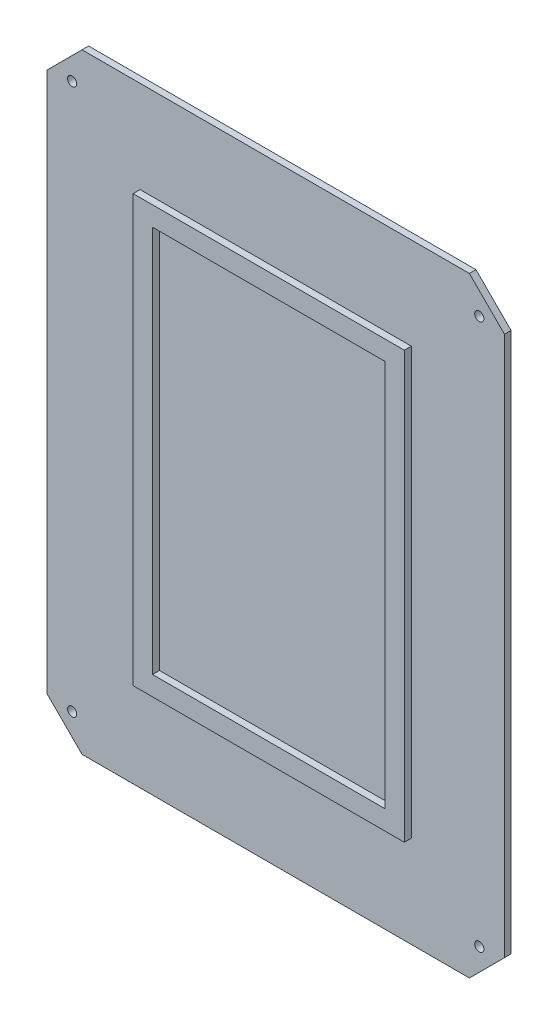
ISO-10303-21;
HEADER;
FILE_DESCRIPTION(('STEP AP214'),'2;1');
FILE_NAME('part.step','',(''),(''),'','','');
FILE_SCHEMA(('AUTOMOTIVE_DESIGN { 1 0 10303 214 1 1 1 1 }'));
ENDSEC;
DATA;
#1=APPLICATION_CONTEXT('core data for automotive mechanical design processes');
#2=APPLICATION_PROTOCOL_DEFINITION('international standard','automotive_design',2000,#1);
#3=PRODUCT_CONTEXT('',#1,'mechanical');
#4=PRODUCT('Part','Part','',(#3));
#5=PRODUCT_RELATED_PRODUCT_CATEGORY('part','',(#4));
#6=PRODUCT_DEFINITION_FORMATION('','',#4);
#7=PRODUCT_DEFINITION_CONTEXT('part definition',#1,'design');
#8=PRODUCT_DEFINITION('design','',#6,#7);
#9=PRODUCT_DEFINITION_SHAPE('','',#8);
#10=(LENGTH_UNIT() NAMED_UNIT(*) SI_UNIT(.MILLI.,.METRE.));
#11=(NAMED_UNIT(*) PLANE_ANGLE_UNIT() SI_UNIT($,.RADIAN.));
#12=(NAMED_UNIT(*) SI_UNIT($,.STERADIAN.) SOLID_ANGLE_UNIT());
#13=UNCERTAINTY_MEASURE_WITH_UNIT(LENGTH_MEASURE(1.E-05),#10,'distance_accuracy_value','');
#14=(GEOMETRIC_REPRESENTATION_CONTEXT(3) GLOBAL_UNCERTAINTY_ASSIGNED_CONTEXT((#13)) GLOBAL_UNIT_ASSIGNED_CONTEXT((#10,
#11,#12)) REPRESENTATION_CONTEXT('',''));
#15=CARTESIAN_POINT('',(0.,0.,0.));
#16=DIRECTION('',(0.,0.,1.));
#17=DIRECTION('',(1.,0.,0.));
#18=AXIS2_PLACEMENT_3D('',#15,#16,#17);
#19=CARTESIAN_POINT('',(-149.987,-177.025,-2.159));
#20=DIRECTION('',(-1.,0.,0.));
#21=DIRECTION('',(0.,0.,1.));
#22=AXIS2_PLACEMENT_3D('',#19,#20,#21);
#23=PLANE('',#22);
#24=DIRECTION('',(0.,0.,1.));
#25=VECTOR('',#24,1.);
#26=CARTESIAN_POINT('',(-149.987,-177.025,-2.159));
#27=LINE('',#26,#25);
#28=CARTESIAN_POINT('',(-149.987,-177.025,-2.159));
#29=VERTEX_POINT('',#28);
#30=CARTESIAN_POINT('',(-149.987,-177.025,2.159));
#31=VERTEX_POINT('',#30);
#32=EDGE_CURVE('E263',#29,#31,#27,.T.);
#33=ORIENTED_EDGE('',*,*,#32,.T.);
#34=DIRECTION('',(0.,-1.,0.));
#35=VECTOR('',#34,1.);
#36=CARTESIAN_POINT('',(-149.987,-177.025,2.159));
#37=LINE('',#36,#35);
#38=CARTESIAN_POINT('',(-149.987,177.025,2.159));
#39=VERTEX_POINT('',#38);
#40=EDGE_CURVE('E209',#39,#31,#37,.T.);
#41=ORIENTED_EDGE('',*,*,#40,.F.);
#42=DIRECTION('',(0.,0.,1.));
#43=VECTOR('',#42,1.);
#44=CARTESIAN_POINT('',(-149.987,177.025,-2.159));
#45=LINE('',#44,#43);
#46=CARTESIAN_POINT('',(-149.987,177.025,-2.159));
#47=VERTEX_POINT('',#46);
#48=EDGE_CURVE('E262',#47,#39,#45,.T.);
#49=ORIENTED_EDGE('',*,*,#48,.F.);
#50=DIRECTION('',(0.,-1.,0.));
#51=VECTOR('',#50,1.);
#52=CARTESIAN_POINT('',(-149.987,-177.025,-2.159));
#53=LINE('',#52,#51);
#54=EDGE_CURVE('E237',#47,#29,#53,.T.);
#55=ORIENTED_EDGE('',*,*,#54,.T.);
#56=EDGE_LOOP('',(#33,#41,#49,#55));
#57=FACE_BOUND('',#56,.T.);
#58=ADVANCED_FACE('F41',(#57),#23,.T.);
#59=CARTESIAN_POINT('',(-149.987,177.025,-2.159));
#60=DIRECTION('',(-0.707106781186549,0.707106781186546,0.));
#61=DIRECTION('',(-0.707106781186546,-0.707106781186549,0.));
#62=AXIS2_PLACEMENT_3D('',#59,#60,#61);
#63=PLANE('',#62);
#64=ORIENTED_EDGE('',*,*,#48,.T.);
#65=DIRECTION('',(-0.707106781186546,-0.707106781186549,0.));
#66=VECTOR('',#65,1.);
#67=CARTESIAN_POINT('',(-149.987,177.025,2.159));
#68=LINE('',#67,#66);
#69=CARTESIAN_POINT('',(-126.987,200.025,2.159));
#70=VERTEX_POINT('',#69);
#71=EDGE_CURVE('E236',#70,#39,#68,.T.);
#72=ORIENTED_EDGE('',*,*,#71,.F.);
#73=DIRECTION('',(0.,0.,1.));
#74=VECTOR('',#73,1.);
#75=CARTESIAN_POINT('',(-126.987,200.025,-2.159));
#76=LINE('',#75,#74);
#77=CARTESIAN_POINT('',(-126.987,200.025,-2.159));
#78=VERTEX_POINT('',#77);
#79=EDGE_CURVE('E269',#78,#70,#76,.T.);
#80=ORIENTED_EDGE('',*,*,#79,.F.);
#81=DIRECTION('',(-0.707106781186546,-0.707106781186549,0.));
#82=VECTOR('',#81,1.);
#83=CARTESIAN_POINT('',(-149.987,177.025,-2.159));
#84=LINE('',#83,#82);
#85=EDGE_CURVE('E257',#78,#47,#84,.T.);
#86=ORIENTED_EDGE('',*,*,#85,.T.);
#87=EDGE_LOOP('',(#64,#72,#80,#86));
#88=FACE_BOUND('',#87,.T.);
#89=ADVANCED_FACE('F321',(#88),#63,.T.);
#90=CARTESIAN_POINT('',(-126.987,200.025,-2.159));
#91=DIRECTION('',(0.,1.,0.));
#92=DIRECTION('',(0.,0.,1.));
#93=AXIS2_PLACEMENT_3D('',#90,#91,#92);
#94=PLANE('',#93);
#95=ORIENTED_EDGE('',*,*,#79,.T.);
#96=DIRECTION('',(-1.,0.,0.));
#97=VECTOR('',#96,1.);
#98=CARTESIAN_POINT('',(-126.987,200.025,2.159));
#99=LINE('',#98,#97);
#100=CARTESIAN_POINT('',(126.987,200.025,2.159));
#101=VERTEX_POINT('',#100);
#102=EDGE_CURVE('E231',#101,#70,#99,.T.);
#103=ORIENTED_EDGE('',*,*,#102,.F.);
#104=DIRECTION('',(0.,0.,1.));
#105=VECTOR('',#104,1.);
#106=CARTESIAN_POINT('',(126.987,200.025,-2.159));
#107=LINE('',#106,#105);
#108=CARTESIAN_POINT('',(126.987,200.025,-2.159));
#109=VERTEX_POINT('',#108);
#110=EDGE_CURVE('E266',#109,#101,#107,.T.);
#111=ORIENTED_EDGE('',*,*,#110,.F.);
#112=DIRECTION('',(-1.,0.,0.));
#113=VECTOR('',#112,1.);
#114=CARTESIAN_POINT('',(-126.987,200.025,-2.159));
#115=LINE('',#114,#113);
#116=EDGE_CURVE('E260',#109,#78,#115,.T.);
#117=ORIENTED_EDGE('',*,*,#116,.T.);
#118=EDGE_LOOP('',(#95,#103,#111,#117));
#119=FACE_BOUND('',#118,.T.);
#120=ADVANCED_FACE('F328',(#119),#94,.T.);
#121=CARTESIAN_POINT('',(126.987,200.025,-2.159));
#122=DIRECTION('',(0.707106781186555,0.70710678118654,0.));
#123=DIRECTION('',(-0.70710678118654,0.707106781186555,0.));
#124=AXIS2_PLACEMENT_3D('',#121,#122,#123);
#125=PLANE('',#124);
#126=ORIENTED_EDGE('',*,*,#110,.T.);
#127=DIRECTION('',(-0.70710678118654,0.707106781186555,0.));
#128=VECTOR('',#127,1.);
#129=CARTESIAN_POINT('',(126.987,200.025,2.159));
#130=LINE('',#129,#128);
#131=CARTESIAN_POINT('',(149.987,177.025,2.159));
#132=VERTEX_POINT('',#131);
#133=EDGE_CURVE('E229',#132,#101,#130,.T.);
#134=ORIENTED_EDGE('',*,*,#133,.F.);
#135=DIRECTION('',(0.,0.,1.));
#136=VECTOR('',#135,1.);
#137=CARTESIAN_POINT('',(149.987,177.025,-2.159));
#138=LINE('',#137,#136);
#139=CARTESIAN_POINT('',(149.987,177.025,-2.159));
#140=VERTEX_POINT('',#139);
#141=EDGE_CURVE('E272',#140,#132,#138,.T.);
#142=ORIENTED_EDGE('',*,*,#141,.F.);
#143=DIRECTION('',(-0.70710678118654,0.707106781186555,0.));
#144=VECTOR('',#143,1.);
#145=CARTESIAN_POINT('',(126.987,200.025,-2.159));
#146=LINE('',#145,#144);
#147=EDGE_CURVE('E251',#140,#109,#146,.T.);
#148=ORIENTED_EDGE('',*,*,#147,.T.);
#149=EDGE_LOOP('',(#126,#134,#142,#148));
#150=FACE_BOUND('',#149,.T.);
#151=ADVANCED_FACE('F356',(#150),#125,.T.);
#152=CARTESIAN_POINT('',(149.987,177.025,-2.159));
#153=DIRECTION('',(1.,0.,0.));
#154=DIRECTION('',(0.,1.,0.));
#155=AXIS2_PLACEMENT_3D('',#152,#153,#154);
#156=PLANE('',#155);
#157=ORIENTED_EDGE('',*,*,#141,.T.);
#158=DIRECTION('',(0.,1.,0.));
#159=VECTOR('',#158,1.);
#160=CARTESIAN_POINT('',(149.987,177.025,2.159));
#161=LINE('',#160,#159);
#162=CARTESIAN_POINT('',(149.987,-177.025,2.159));
#163=VERTEX_POINT('',#162);
#164=EDGE_CURVE('E227',#163,#132,#161,.T.);
#165=ORIENTED_EDGE('',*,*,#164,.F.);
#166=DIRECTION('',(0.,0.,1.));
#167=VECTOR('',#166,1.);
#168=CARTESIAN_POINT('',(149.987,-177.025,-2.159));
#169=LINE('',#168,#167);
#170=CARTESIAN_POINT('',(149.987,-177.025,-2.159));
#171=VERTEX_POINT('',#170);
#172=EDGE_CURVE('E271',#171,#163,#169,.T.);
#173=ORIENTED_EDGE('',*,*,#172,.F.);
#174=DIRECTION('',(0.,1.,0.));
#175=VECTOR('',#174,1.);
#176=CARTESIAN_POINT('',(149.987,177.025,-2.159));
#177=LINE('',#176,#175);
#178=EDGE_CURVE('E252',#171,#140,#177,.T.);
#179=ORIENTED_EDGE('',*,*,#178,.T.);
#180=EDGE_LOOP('',(#157,#165,#173,#179));
#181=FACE_BOUND('',#180,.T.);
#182=ADVANCED_FACE('F353',(#181),#156,.T.);
#183=CARTESIAN_POINT('',(149.987,-177.025,-2.159));
#184=DIRECTION('',(0.707106781186549,-0.707106781186546,0.));
#185=DIRECTION('',(0.707106781186546,0.707106781186549,0.));
#186=AXIS2_PLACEMENT_3D('',#183,#184,#185);
#187=PLANE('',#186);
#188=ORIENTED_EDGE('',*,*,#172,.T.);
#189=DIRECTION('',(0.707106781186546,0.707106781186549,0.));
#190=VECTOR('',#189,1.);
#191=CARTESIAN_POINT('',(149.987,-177.025,2.159));
#192=LINE('',#191,#190);
#193=CARTESIAN_POINT('',(126.987,-200.025,2.159));
#194=VERTEX_POINT('',#193);
#195=EDGE_CURVE('E221',#194,#163,#192,.T.);
#196=ORIENTED_EDGE('',*,*,#195,.F.);
#197=DIRECTION('',(0.,0.,1.));
#198=VECTOR('',#197,1.);
#199=CARTESIAN_POINT('',(126.987,-200.025,-2.159));
#200=LINE('',#199,#198);
#201=CARTESIAN_POINT('',(126.987,-200.025,-2.159));
#202=VERTEX_POINT('',#201);
#203=EDGE_CURVE('E273',#202,#194,#200,.T.);
#204=ORIENTED_EDGE('',*,*,#203,.F.);
#205=DIRECTION('',(0.707106781186546,0.707106781186549,0.));
#206=VECTOR('',#205,1.);
#207=CARTESIAN_POINT('',(149.987,-177.025,-2.159));
#208=LINE('',#207,#206);
#209=EDGE_CURVE('E247',#202,#171,#208,.T.);
#210=ORIENTED_EDGE('',*,*,#209,.T.);
#211=EDGE_LOOP('',(#188,#196,#204,#210));
#212=FACE_BOUND('',#211,.T.);
#213=ADVANCED_FACE('F355',(#212),#187,.T.);
#214=CARTESIAN_POINT('',(126.987,-200.025,-2.159));
#215=DIRECTION('',(0.,-1.,0.));
#216=DIRECTION('',(1.,0.,0.));
#217=AXIS2_PLACEMENT_3D('',#214,#215,#216);
#218=PLANE('',#217);
#219=ORIENTED_EDGE('',*,*,#203,.T.);
#220=DIRECTION('',(1.,0.,0.));
#221=VECTOR('',#220,1.);
#222=CARTESIAN_POINT('',(126.987,-200.025,2.159));
#223=LINE('',#222,#221);
#224=CARTESIAN_POINT('',(-126.987,-200.025,2.159));
#225=VERTEX_POINT('',#224);
#226=EDGE_CURVE('E222',#225,#194,#223,.T.);
#227=ORIENTED_EDGE('',*,*,#226,.F.);
#228=DIRECTION('',(0.,0.,1.));
#229=VECTOR('',#228,1.);
#230=CARTESIAN_POINT('',(-126.987,-200.025,-2.159));
#231=LINE('',#230,#229);
#232=CARTESIAN_POINT('',(-126.987,-200.025,-2.159));
#233=VERTEX_POINT('',#232);
#234=EDGE_CURVE('E280',#233,#225,#231,.T.);
#235=ORIENTED_EDGE('',*,*,#234,.F.);
#236=DIRECTION('',(1.,0.,0.));
#237=VECTOR('',#236,1.);
#238=CARTESIAN_POINT('',(126.987,-200.025,-2.159));
#239=LINE('',#238,#237);
#240=EDGE_CURVE('E244',#233,#202,#239,.T.);
#241=ORIENTED_EDGE('',*,*,#240,.T.);
#242=EDGE_LOOP('',(#219,#227,#235,#241));
#243=FACE_BOUND('',#242,.T.);
#244=ADVANCED_FACE('F347',(#243),#218,.T.);
#245=CARTESIAN_POINT('',(-126.987,-200.025,-2.159));
#246=DIRECTION('',(-0.707106781186552,-0.707106781186543,0.));
#247=DIRECTION('',(0.707106781186543,-0.707106781186552,0.));
#248=AXIS2_PLACEMENT_3D('',#245,#246,#247);
#249=PLANE('',#248);
#250=ORIENTED_EDGE('',*,*,#234,.T.);
#251=DIRECTION('',(0.707106781186543,-0.707106781186552,0.));
#252=VECTOR('',#251,1.);
#253=CARTESIAN_POINT('',(-126.987,-200.025,2.159));
#254=LINE('',#253,#252);
#255=EDGE_CURVE('E218',#31,#225,#254,.T.);
#256=ORIENTED_EDGE('',*,*,#255,.F.);
#257=ORIENTED_EDGE('',*,*,#32,.F.);
#258=DIRECTION('',(0.707106781186543,-0.707106781186552,0.));
#259=VECTOR('',#258,1.);
#260=CARTESIAN_POINT('',(-126.987,-200.025,-2.159));
#261=LINE('',#260,#259);
#262=EDGE_CURVE('E245',#29,#233,#261,.T.);
#263=ORIENTED_EDGE('',*,*,#262,.T.);
#264=EDGE_LOOP('',(#250,#256,#257,#263));
#265=FACE_BOUND('',#264,.T.);
#266=ADVANCED_FACE('F337',(#265),#249,.T.);
#267=CARTESIAN_POINT('',(0.,0.,-2.159));
#268=DIRECTION('',(0.,0.,-1.));
#269=DIRECTION('',(-1.,0.,0.));
#270=AXIS2_PLACEMENT_3D('',#267,#268,#269);
#271=PLANE('',#270);
#272=CARTESIAN_POINT('',(-133.477,-178.943,-2.159));
#273=DIRECTION('',(0.,0.,-1.));
#274=DIRECTION('',(-1.,0.,0.));
#275=AXIS2_PLACEMENT_3D('',#272,#273,#274);
#276=CIRCLE('',#275,2.99999999999999);
#277=CARTESIAN_POINT('',(-136.477,-178.943,-2.159));
#278=VERTEX_POINT('',#277);
#279=EDGE_CURVE('E438',#278,#278,#276,.T.);
#280=ORIENTED_EDGE('',*,*,#279,.F.);
#281=EDGE_LOOP('',(#280));
#282=FACE_BOUND('',#281,.T.);
#283=CARTESIAN_POINT('',(133.477,-178.943,-2.159));
#284=DIRECTION('',(0.,0.,-1.));
#285=DIRECTION('',(-1.,0.,0.));
#286=AXIS2_PLACEMENT_3D('',#283,#284,#285);
#287=CIRCLE('',#286,2.99999999999999);
#288=CARTESIAN_POINT('',(130.477,-178.943,-2.159));
#289=VERTEX_POINT('',#288);
#290=EDGE_CURVE('E434',#289,#289,#287,.T.);
#291=ORIENTED_EDGE('',*,*,#290,.F.);
#292=EDGE_LOOP('',(#291));
#293=FACE_BOUND('',#292,.T.);
#294=CARTESIAN_POINT('',(133.477,178.943,-2.159));
#295=DIRECTION('',(0.,0.,-1.));
#296=DIRECTION('',(-1.,0.,0.));
#297=AXIS2_PLACEMENT_3D('',#294,#295,#296);
#298=CIRCLE('',#297,2.99999999999999);
#299=CARTESIAN_POINT('',(130.477,178.943,-2.159));
#300=VERTEX_POINT('',#299);
#301=EDGE_CURVE('E433',#300,#300,#298,.T.);
#302=ORIENTED_EDGE('',*,*,#301,.F.);
#303=EDGE_LOOP('',(#302));
#304=FACE_BOUND('',#303,.T.);
#305=CARTESIAN_POINT('',(-133.477,178.943,-2.159));
#306=DIRECTION('',(0.,0.,-1.));
#307=DIRECTION('',(-1.,0.,0.));
#308=AXIS2_PLACEMENT_3D('',#305,#306,#307);
#309=CIRCLE('',#308,2.99999999999999);
#310=CARTESIAN_POINT('',(-136.477,178.943,-2.159));
#311=VERTEX_POINT('',#310);
#312=EDGE_CURVE('E182',#311,#311,#309,.T.);
#313=ORIENTED_EDGE('',*,*,#312,.F.);
#314=EDGE_LOOP('',(#313));
#315=FACE_BOUND('',#314,.T.);
#316=ORIENTED_EDGE('',*,*,#54,.F.);
#317=ORIENTED_EDGE('',*,*,#85,.F.);
#318=ORIENTED_EDGE('',*,*,#116,.F.);
#319=ORIENTED_EDGE('',*,*,#147,.F.);
#320=ORIENTED_EDGE('',*,*,#178,.F.);
#321=ORIENTED_EDGE('',*,*,#209,.F.);
#322=ORIENTED_EDGE('',*,*,#240,.F.);
#323=ORIENTED_EDGE('',*,*,#262,.F.);
#324=EDGE_LOOP('',(#316,#317,#318,#319,#320,#321,#322,#323));
#325=FACE_BOUND('',#324,.T.);
#326=ADVANCED_FACE('F341',(#282,#293,#304,#315,#325),#271,.T.);
#327=CARTESIAN_POINT('',(0.,0.,2.159));
#328=DIRECTION('',(0.,0.,-1.));
#329=DIRECTION('',(-1.,0.,0.));
#330=AXIS2_PLACEMENT_3D('',#327,#328,#329);
#331=PLANE('',#330);
#332=CARTESIAN_POINT('',(-133.477,-178.943,2.159));
#333=DIRECTION('',(0.,0.,-1.));
#334=DIRECTION('',(-1.,0.,0.));
#335=AXIS2_PLACEMENT_3D('',#332,#333,#334);
#336=CIRCLE('',#335,2.99999999999999);
#337=CARTESIAN_POINT('',(-136.477,-178.943,2.159));
#338=VERTEX_POINT('',#337);
#339=EDGE_CURVE('E42',#338,#338,#336,.T.);
#340=ORIENTED_EDGE('',*,*,#339,.T.);
#341=EDGE_LOOP('',(#340));
#342=FACE_BOUND('',#341,.T.);
#343=CARTESIAN_POINT('',(133.477,-178.943,2.159));
#344=DIRECTION('',(0.,0.,-1.));
#345=DIRECTION('',(-1.,0.,0.));
#346=AXIS2_PLACEMENT_3D('',#343,#344,#345);
#347=CIRCLE('',#346,2.99999999999999);
#348=CARTESIAN_POINT('',(130.477,-178.943,2.159));
#349=VERTEX_POINT('',#348);
#350=EDGE_CURVE('E181',#349,#349,#347,.T.);
#351=ORIENTED_EDGE('',*,*,#350,.T.);
#352=EDGE_LOOP('',(#351));
#353=FACE_BOUND('',#352,.T.);
#354=CARTESIAN_POINT('',(133.477,178.943,2.159));
#355=DIRECTION('',(0.,0.,-1.));
#356=DIRECTION('',(-1.,0.,0.));
#357=AXIS2_PLACEMENT_3D('',#354,#355,#356);
#358=CIRCLE('',#357,2.99999999999999);
#359=CARTESIAN_POINT('',(130.477,178.943,2.159));
#360=VERTEX_POINT('',#359);
#361=EDGE_CURVE('E296',#360,#360,#358,.T.);
#362=ORIENTED_EDGE('',*,*,#361,.T.);
#363=EDGE_LOOP('',(#362));
#364=FACE_BOUND('',#363,.T.);
#365=CARTESIAN_POINT('',(-133.477,178.943,2.159));
#366=DIRECTION('',(0.,0.,-1.));
#367=DIRECTION('',(-1.,0.,0.));
#368=AXIS2_PLACEMENT_3D('',#365,#366,#367);
#369=CIRCLE('',#368,2.99999999999999);
#370=CARTESIAN_POINT('',(-136.477,178.943,2.159));
#371=VERTEX_POINT('',#370);
#372=EDGE_CURVE('E294',#371,#371,#369,.T.);
#373=ORIENTED_EDGE('',*,*,#372,.T.);
#374=EDGE_LOOP('',(#373));
#375=FACE_BOUND('',#374,.T.);
#376=DIRECTION('',(-1.,0.,0.));
#377=VECTOR('',#376,1.);
#378=CARTESIAN_POINT('',(0.,-139.7,2.159));
#379=LINE('',#378,#377);
#380=CARTESIAN_POINT('',(88.9,-139.7,2.159));
#381=VERTEX_POINT('',#380);
#382=CARTESIAN_POINT('',(-88.9,-139.7,2.159));
#383=VERTEX_POINT('',#382);
#384=EDGE_CURVE('E47',#381,#383,#379,.T.);
#385=ORIENTED_EDGE('',*,*,#384,.T.);
#386=DIRECTION('',(0.,1.,0.));
#387=VECTOR('',#386,1.);
#388=CARTESIAN_POINT('',(-88.9,0.,2.159));
#389=LINE('',#388,#387);
#390=CARTESIAN_POINT('',(-88.9,139.7,2.159));
#391=VERTEX_POINT('',#390);
#392=EDGE_CURVE('E11',#383,#391,#389,.T.);
#393=ORIENTED_EDGE('',*,*,#392,.T.);
#394=DIRECTION('',(1.,0.,0.));
#395=VECTOR('',#394,1.);
#396=CARTESIAN_POINT('',(0.,139.7,2.159));
#397=LINE('',#396,#395);
#398=CARTESIAN_POINT('',(88.9,139.7,2.159));
#399=VERTEX_POINT('',#398);
#400=EDGE_CURVE('E289',#391,#399,#397,.T.);
#401=ORIENTED_EDGE('',*,*,#400,.T.);
#402=DIRECTION('',(0.,-1.,0.));
#403=VECTOR('',#402,1.);
#404=CARTESIAN_POINT('',(88.9,0.,2.159));
#405=LINE('',#404,#403);
#406=EDGE_CURVE('E288',#399,#381,#405,.T.);
#407=ORIENTED_EDGE('',*,*,#406,.T.);
#408=EDGE_LOOP('',(#385,#393,#401,#407));
#409=FACE_BOUND('',#408,.T.);
#410=ORIENTED_EDGE('',*,*,#40,.T.);
#411=ORIENTED_EDGE('',*,*,#255,.T.);
#412=ORIENTED_EDGE('',*,*,#226,.T.);
#413=ORIENTED_EDGE('',*,*,#195,.T.);
#414=ORIENTED_EDGE('',*,*,#164,.T.);
#415=ORIENTED_EDGE('',*,*,#133,.T.);
#416=ORIENTED_EDGE('',*,*,#102,.T.);
#417=ORIENTED_EDGE('',*,*,#71,.T.);
#418=EDGE_LOOP('',(#410,#411,#412,#413,#414,#415,#416,#417));
#419=FACE_BOUND('',#418,.T.);
#420=ADVANCED_FACE('F303',(#342,#353,#364,#375,#409,#419),#331,.F.);
#421=CARTESIAN_POINT('',(-88.9,139.7,6.731));
#422=DIRECTION('',(-1.,0.,0.));
#423=DIRECTION('',(0.,0.,1.));
#424=AXIS2_PLACEMENT_3D('',#421,#422,#423);
#425=PLANE('',#424);
#426=ORIENTED_EDGE('',*,*,#392,.F.);
#427=DIRECTION('',(0.,0.,-1.));
#428=VECTOR('',#427,1.);
#429=CARTESIAN_POINT('',(-88.9,-139.7,6.731));
#430=LINE('',#429,#428);
#431=CARTESIAN_POINT('',(-88.9,-139.7,6.731));
#432=VERTEX_POINT('',#431);
#433=EDGE_CURVE('E207',#432,#383,#430,.T.);
#434=ORIENTED_EDGE('',*,*,#433,.F.);
#435=DIRECTION('',(0.,1.,0.));
#436=VECTOR('',#435,1.);
#437=CARTESIAN_POINT('',(-88.9,139.7,6.731));
#438=LINE('',#437,#436);
#439=CARTESIAN_POINT('',(-88.9,139.7,6.731));
#440=VERTEX_POINT('',#439);
#441=EDGE_CURVE('E188',#432,#440,#438,.T.);
#442=ORIENTED_EDGE('',*,*,#441,.T.);
#443=DIRECTION('',(0.,0.,-1.));
#444=VECTOR('',#443,1.);
#445=CARTESIAN_POINT('',(-88.9,139.7,6.731));
#446=LINE('',#445,#444);
#447=EDGE_CURVE('E203',#440,#391,#446,.T.);
#448=ORIENTED_EDGE('',*,*,#447,.T.);
#449=EDGE_LOOP('',(#426,#434,#442,#448));
#450=FACE_BOUND('',#449,.T.);
#451=ADVANCED_FACE('F381',(#450),#425,.T.);
#452=CARTESIAN_POINT('',(88.9,-139.7,6.731));
#453=DIRECTION('',(0.,-1.,0.));
#454=DIRECTION('',(0.,0.,-1.));
#455=AXIS2_PLACEMENT_3D('',#452,#453,#454);
#456=PLANE('',#455);
#457=ORIENTED_EDGE('',*,*,#384,.F.);
#458=DIRECTION('',(0.,0.,-1.));
#459=VECTOR('',#458,1.);
#460=CARTESIAN_POINT('',(88.9,-139.7,6.731));
#461=LINE('',#460,#459);
#462=CARTESIAN_POINT('',(88.9,-139.7,6.731));
#463=VERTEX_POINT('',#462);
#464=EDGE_CURVE('E208',#463,#381,#461,.T.);
#465=ORIENTED_EDGE('',*,*,#464,.F.);
#466=DIRECTION('',(-1.,0.,0.));
#467=VECTOR('',#466,1.);
#468=CARTESIAN_POINT('',(88.9,-139.7,6.731));
#469=LINE('',#468,#467);
#470=EDGE_CURVE('E204',#463,#432,#469,.T.);
#471=ORIENTED_EDGE('',*,*,#470,.T.);
#472=ORIENTED_EDGE('',*,*,#433,.T.);
#473=EDGE_LOOP('',(#457,#465,#471,#472));
#474=FACE_BOUND('',#473,.T.);
#475=ADVANCED_FACE('F395',(#474),#456,.T.);
#476=CARTESIAN_POINT('',(88.9,139.7,6.731));
#477=DIRECTION('',(1.,0.,0.));
#478=DIRECTION('',(0.,0.,-1.));
#479=AXIS2_PLACEMENT_3D('',#476,#477,#478);
#480=PLANE('',#479);
#481=ORIENTED_EDGE('',*,*,#406,.F.);
#482=DIRECTION('',(0.,0.,-1.));
#483=VECTOR('',#482,1.);
#484=CARTESIAN_POINT('',(88.9,139.7,6.731));
#485=LINE('',#484,#483);
#486=CARTESIAN_POINT('',(88.9,139.7,6.731));
#487=VERTEX_POINT('',#486);
#488=EDGE_CURVE('E60',#487,#399,#485,.T.);
#489=ORIENTED_EDGE('',*,*,#488,.F.);
#490=DIRECTION('',(0.,-1.,0.));
#491=VECTOR('',#490,1.);
#492=CARTESIAN_POINT('',(88.9,139.7,6.731));
#493=LINE('',#492,#491);
#494=EDGE_CURVE('E197',#487,#463,#493,.T.);
#495=ORIENTED_EDGE('',*,*,#494,.T.);
#496=ORIENTED_EDGE('',*,*,#464,.T.);
#497=EDGE_LOOP('',(#481,#489,#495,#496));
#498=FACE_BOUND('',#497,.T.);
#499=ADVANCED_FACE('F399',(#498),#480,.T.);
#500=CARTESIAN_POINT('',(88.9,139.7,6.731));
#501=DIRECTION('',(0.,1.,0.));
#502=DIRECTION('',(0.,0.,1.));
#503=AXIS2_PLACEMENT_3D('',#500,#501,#502);
#504=PLANE('',#503);
#505=ORIENTED_EDGE('',*,*,#400,.F.);
#506=ORIENTED_EDGE('',*,*,#447,.F.);
#507=DIRECTION('',(1.,0.,0.));
#508=VECTOR('',#507,1.);
#509=CARTESIAN_POINT('',(88.9,139.7,6.731));
#510=LINE('',#509,#508);
#511=EDGE_CURVE('E200',#440,#487,#510,.T.);
#512=ORIENTED_EDGE('',*,*,#511,.T.);
#513=ORIENTED_EDGE('',*,*,#488,.T.);
#514=EDGE_LOOP('',(#505,#506,#512,#513));
#515=FACE_BOUND('',#514,.T.);
#516=ADVANCED_FACE('F392',(#515),#504,.T.);
#517=CARTESIAN_POINT('',(-76.1999999999999,127.,6.731));
#518=DIRECTION('',(-1.,0.,0.));
#519=DIRECTION('',(0.,0.,1.));
#520=AXIS2_PLACEMENT_3D('',#517,#518,#519);
#521=PLANE('',#520);
#522=DIRECTION('',(0.,0.,-1.));
#523=VECTOR('',#522,1.);
#524=CARTESIAN_POINT('',(-76.1999999999999,-127.,6.731));
#525=LINE('',#524,#523);
#526=CARTESIAN_POINT('',(-76.1999999999999,-127.,6.731));
#527=VERTEX_POINT('',#526);
#528=CARTESIAN_POINT('',(-76.1999999999999,-127.,2.159));
#529=VERTEX_POINT('',#528);
#530=EDGE_CURVE('E189',#527,#529,#525,.T.);
#531=ORIENTED_EDGE('',*,*,#530,.T.);
#532=DIRECTION('',(0.,1.,0.));
#533=VECTOR('',#532,1.);
#534=CARTESIAN_POINT('',(-76.1999999999999,0.,2.159));
#535=LINE('',#534,#533);
#536=CARTESIAN_POINT('',(-76.1999999999999,127.,2.159));
#537=VERTEX_POINT('',#536);
#538=EDGE_CURVE('E62',#529,#537,#535,.T.);
#539=ORIENTED_EDGE('',*,*,#538,.T.);
#540=DIRECTION('',(0.,0.,-1.));
#541=VECTOR('',#540,1.);
#542=CARTESIAN_POINT('',(-76.1999999999999,127.,6.731));
#543=LINE('',#542,#541);
#544=CARTESIAN_POINT('',(-76.1999999999999,127.,6.731));
#545=VERTEX_POINT('',#544);
#546=EDGE_CURVE('E154',#545,#537,#543,.T.);
#547=ORIENTED_EDGE('',*,*,#546,.F.);
#548=DIRECTION('',(0.,1.,0.));
#549=VECTOR('',#548,1.);
#550=CARTESIAN_POINT('',(-76.1999999999999,127.,6.731));
#551=LINE('',#550,#549);
#552=EDGE_CURVE('E158',#527,#545,#551,.T.);
#553=ORIENTED_EDGE('',*,*,#552,.F.);
#554=EDGE_LOOP('',(#531,#539,#547,#553));
#555=FACE_BOUND('',#554,.T.);
#556=ADVANCED_FACE('F160',(#555),#521,.F.);
#557=CARTESIAN_POINT('',(76.2,-127.,6.731));
#558=DIRECTION('',(0.,-1.,0.));
#559=DIRECTION('',(0.,0.,-1.));
#560=AXIS2_PLACEMENT_3D('',#557,#558,#559);
#561=PLANE('',#560);
#562=DIRECTION('',(0.,0.,-1.));
#563=VECTOR('',#562,1.);
#564=CARTESIAN_POINT('',(76.2,-127.,6.731));
#565=LINE('',#564,#563);
#566=CARTESIAN_POINT('',(76.2,-127.,6.731));
#567=VERTEX_POINT('',#566);
#568=CARTESIAN_POINT('',(76.2,-127.,2.159));
#569=VERTEX_POINT('',#568);
#570=EDGE_CURVE('E193',#567,#569,#565,.T.);
#571=ORIENTED_EDGE('',*,*,#570,.T.);
#572=DIRECTION('',(-1.,0.,0.));
#573=VECTOR('',#572,1.);
#574=CARTESIAN_POINT('',(0.,-127.,2.159));
#575=LINE('',#574,#573);
#576=EDGE_CURVE('E282',#569,#529,#575,.T.);
#577=ORIENTED_EDGE('',*,*,#576,.T.);
#578=ORIENTED_EDGE('',*,*,#530,.F.);
#579=DIRECTION('',(-1.,0.,0.));
#580=VECTOR('',#579,1.);
#581=CARTESIAN_POINT('',(76.2,-127.,6.731));
#582=LINE('',#581,#580);
#583=EDGE_CURVE('E164',#567,#527,#582,.T.);
#584=ORIENTED_EDGE('',*,*,#583,.F.);
#585=EDGE_LOOP('',(#571,#577,#578,#584));
#586=FACE_BOUND('',#585,.T.);
#587=ADVANCED_FACE('F406',(#586),#561,.F.);
#588=CARTESIAN_POINT('',(76.2,127.,6.731));
#589=DIRECTION('',(1.,0.,0.));
#590=DIRECTION('',(0.,0.,-1.));
#591=AXIS2_PLACEMENT_3D('',#588,#589,#590);
#592=PLANE('',#591);
#593=DIRECTION('',(0.,0.,-1.));
#594=VECTOR('',#593,1.);
#595=CARTESIAN_POINT('',(76.2,127.,6.731));
#596=LINE('',#595,#594);
#597=CARTESIAN_POINT('',(76.2,127.,6.731));
#598=VERTEX_POINT('',#597);
#599=CARTESIAN_POINT('',(76.2,127.,2.159));
#600=VERTEX_POINT('',#599);
#601=EDGE_CURVE('E165',#598,#600,#596,.T.);
#602=ORIENTED_EDGE('',*,*,#601,.T.);
#603=DIRECTION('',(0.,-1.,0.));
#604=VECTOR('',#603,1.);
#605=CARTESIAN_POINT('',(76.2,0.,2.159));
#606=LINE('',#605,#604);
#607=EDGE_CURVE('E281',#600,#569,#606,.T.);
#608=ORIENTED_EDGE('',*,*,#607,.T.);
#609=ORIENTED_EDGE('',*,*,#570,.F.);
#610=DIRECTION('',(0.,-1.,0.));
#611=VECTOR('',#610,1.);
#612=CARTESIAN_POINT('',(76.2,127.,6.731));
#613=LINE('',#612,#611);
#614=EDGE_CURVE('E172',#598,#567,#613,.T.);
#615=ORIENTED_EDGE('',*,*,#614,.F.);
#616=EDGE_LOOP('',(#602,#608,#609,#615));
#617=FACE_BOUND('',#616,.T.);
#618=ADVANCED_FACE('F411',(#617),#592,.F.);
#619=CARTESIAN_POINT('',(76.2,127.,6.731));
#620=DIRECTION('',(0.,1.,0.));
#621=DIRECTION('',(0.,0.,1.));
#622=AXIS2_PLACEMENT_3D('',#619,#620,#621);
#623=PLANE('',#622);
#624=ORIENTED_EDGE('',*,*,#546,.T.);
#625=DIRECTION('',(1.,0.,0.));
#626=VECTOR('',#625,1.);
#627=CARTESIAN_POINT('',(0.,127.,2.159));
#628=LINE('',#627,#626);
#629=EDGE_CURVE('E267',#537,#600,#628,.T.);
#630=ORIENTED_EDGE('',*,*,#629,.T.);
#631=ORIENTED_EDGE('',*,*,#601,.F.);
#632=DIRECTION('',(1.,0.,0.));
#633=VECTOR('',#632,1.);
#634=CARTESIAN_POINT('',(76.2,127.,6.731));
#635=LINE('',#634,#633);
#636=EDGE_CURVE('E169',#545,#598,#635,.T.);
#637=ORIENTED_EDGE('',*,*,#636,.F.);
#638=EDGE_LOOP('',(#624,#630,#631,#637));
#639=FACE_BOUND('',#638,.T.);
#640=ADVANCED_FACE('F167',(#639),#623,.F.);
#641=CARTESIAN_POINT('',(0.,0.,6.731));
#642=DIRECTION('',(0.,0.,-1.));
#643=DIRECTION('',(-1.,0.,0.));
#644=AXIS2_PLACEMENT_3D('',#641,#642,#643);
#645=PLANE('',#644);
#646=ORIENTED_EDGE('',*,*,#583,.T.);
#647=ORIENTED_EDGE('',*,*,#552,.T.);
#648=ORIENTED_EDGE('',*,*,#636,.T.);
#649=ORIENTED_EDGE('',*,*,#614,.T.);
#650=EDGE_LOOP('',(#646,#647,#648,#649));
#651=FACE_BOUND('',#650,.T.);
#652=ORIENTED_EDGE('',*,*,#441,.F.);
#653=ORIENTED_EDGE('',*,*,#470,.F.);
#654=ORIENTED_EDGE('',*,*,#494,.F.);
#655=ORIENTED_EDGE('',*,*,#511,.F.);
#656=EDGE_LOOP('',(#652,#653,#654,#655));
#657=FACE_BOUND('',#656,.T.);
#658=ADVANCED_FACE('F176',(#651,#657),#645,.F.);
#659=ORIENTED_EDGE('',*,*,#538,.F.);
#660=ORIENTED_EDGE('',*,*,#576,.F.);
#661=ORIENTED_EDGE('',*,*,#607,.F.);
#662=ORIENTED_EDGE('',*,*,#629,.F.);
#663=EDGE_LOOP('',(#659,#660,#661,#662));
#664=FACE_BOUND('',#663,.T.);
#665=ADVANCED_FACE('F390',(#664),#331,.F.);
#666=CARTESIAN_POINT('',(-133.477,178.943,6.731));
#667=DIRECTION('',(0.,0.,-1.));
#668=DIRECTION('',(-1.,0.,0.));
#669=AXIS2_PLACEMENT_3D('',#666,#667,#668);
#670=CYLINDRICAL_SURFACE('',#669,2.99999999999999);
#671=ORIENTED_EDGE('',*,*,#312,.T.);
#672=EDGE_LOOP('',(#671));
#673=FACE_BOUND('',#672,.T.);
#674=ORIENTED_EDGE('',*,*,#372,.F.);
#675=EDGE_LOOP('',(#674));
#676=FACE_BOUND('',#675,.T.);
#677=ADVANCED_FACE('F319',(#673,#676),#670,.F.);
#678=CARTESIAN_POINT('',(133.477,178.943,6.731));
#679=DIRECTION('',(0.,0.,-1.));
#680=DIRECTION('',(-1.,0.,0.));
#681=AXIS2_PLACEMENT_3D('',#678,#679,#680);
#682=CYLINDRICAL_SURFACE('',#681,2.99999999999999);
#683=ORIENTED_EDGE('',*,*,#301,.T.);
#684=EDGE_LOOP('',(#683));
#685=FACE_BOUND('',#684,.T.);
#686=ORIENTED_EDGE('',*,*,#361,.F.);
#687=EDGE_LOOP('',(#686));
#688=FACE_BOUND('',#687,.T.);
#689=ADVANCED_FACE('F307',(#685,#688),#682,.F.);
#690=CARTESIAN_POINT('',(133.477,-178.943,6.731));
#691=DIRECTION('',(0.,0.,-1.));
#692=DIRECTION('',(-1.,0.,0.));
#693=AXIS2_PLACEMENT_3D('',#690,#691,#692);
#694=CYLINDRICAL_SURFACE('',#693,2.99999999999999);
#695=ORIENTED_EDGE('',*,*,#290,.T.);
#696=EDGE_LOOP('',(#695));
#697=FACE_BOUND('',#696,.T.);
#698=ORIENTED_EDGE('',*,*,#350,.F.);
#699=EDGE_LOOP('',(#698));
#700=FACE_BOUND('',#699,.T.);
#701=ADVANCED_FACE('F306',(#697,#700),#694,.F.);
#702=CARTESIAN_POINT('',(-133.477,-178.943,6.731));
#703=DIRECTION('',(0.,0.,-1.));
#704=DIRECTION('',(-1.,0.,0.));
#705=AXIS2_PLACEMENT_3D('',#702,#703,#704);
#706=CYLINDRICAL_SURFACE('',#705,2.99999999999999);
#707=ORIENTED_EDGE('',*,*,#279,.T.);
#708=EDGE_LOOP('',(#707));
#709=FACE_BOUND('',#708,.T.);
#710=ORIENTED_EDGE('',*,*,#339,.F.);
#711=EDGE_LOOP('',(#710));
#712=FACE_BOUND('',#711,.T.);
#713=ADVANCED_FACE('F308',(#709,#712),#706,.F.);
#714=CLOSED_SHELL('',(#58,#89,#120,#151,#182,#213,#244,#266,#326,#420,#451,#475,#499,#516,#556,
#587,#618,#640,#658,#665,#677,#689,#701,#713));
#715=MANIFOLD_SOLID_BREP('B2',#714);
#716=ADVANCED_BREP_SHAPE_REPRESENTATION('',(#18,#715),#14);
#717=SHAPE_DEFINITION_REPRESENTATION(#9,#716);
ENDSEC;
END-ISO-10303-21;
